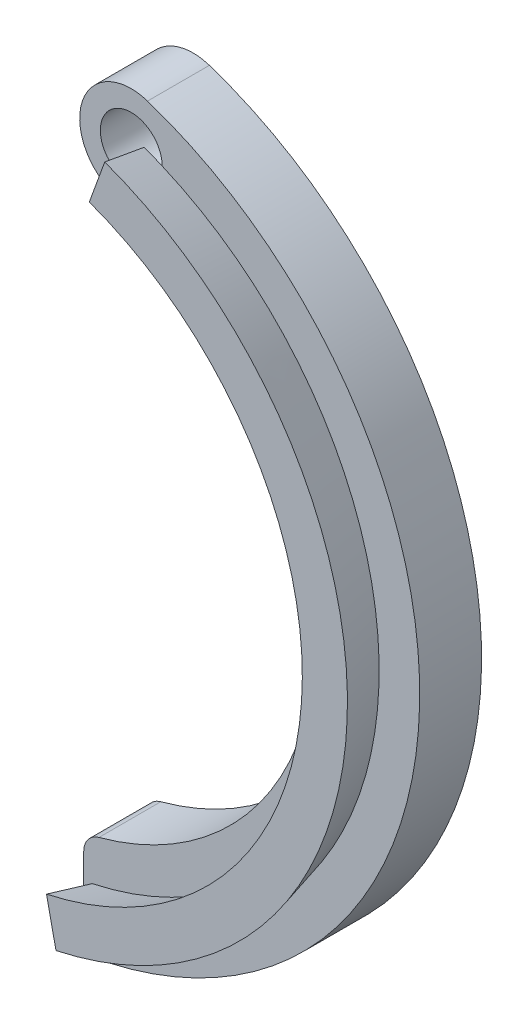
ISO-10303-21;
HEADER;
FILE_DESCRIPTION(('STEP AP214'),'2;1');
FILE_NAME('part.step','',(''),(''),'','','');
FILE_SCHEMA(('AUTOMOTIVE_DESIGN { 1 0 10303 214 1 1 1 1 }'));
ENDSEC;
DATA;
#1=APPLICATION_CONTEXT('core data for automotive mechanical design processes');
#2=APPLICATION_PROTOCOL_DEFINITION('international standard','automotive_design',2000,#1);
#3=PRODUCT_CONTEXT('',#1,'mechanical');
#4=PRODUCT('Part','Part','',(#3));
#5=PRODUCT_RELATED_PRODUCT_CATEGORY('part','',(#4));
#6=PRODUCT_DEFINITION_FORMATION('','',#4);
#7=PRODUCT_DEFINITION_CONTEXT('part definition',#1,'design');
#8=PRODUCT_DEFINITION('design','',#6,#7);
#9=PRODUCT_DEFINITION_SHAPE('','',#8);
#10=(LENGTH_UNIT() NAMED_UNIT(*) SI_UNIT(.MILLI.,.METRE.));
#11=(NAMED_UNIT(*) PLANE_ANGLE_UNIT() SI_UNIT($,.RADIAN.));
#12=(NAMED_UNIT(*) SI_UNIT($,.STERADIAN.) SOLID_ANGLE_UNIT());
#13=UNCERTAINTY_MEASURE_WITH_UNIT(LENGTH_MEASURE(1.E-05),#10,'distance_accuracy_value','');
#14=(GEOMETRIC_REPRESENTATION_CONTEXT(3) GLOBAL_UNCERTAINTY_ASSIGNED_CONTEXT((#13)) GLOBAL_UNIT_ASSIGNED_CONTEXT((#10,
#11,#12)) REPRESENTATION_CONTEXT('',''));
#15=CARTESIAN_POINT('',(0.,0.,0.));
#16=DIRECTION('',(0.,0.,1.));
#17=DIRECTION('',(1.,0.,0.));
#18=AXIS2_PLACEMENT_3D('',#15,#16,#17);
#19=CARTESIAN_POINT('',(-28.,19.,24.));
#20=DIRECTION('',(0.,0.,1.));
#21=DIRECTION('',(1.,0.,0.));
#22=AXIS2_PLACEMENT_3D('',#19,#20,#21);
#23=CYLINDRICAL_SURFACE('',#22,14.2967297963401);
#24=CARTESIAN_POINT('',(-28.,19.,24.));
#25=DIRECTION('',(0.,0.,-1.));
#26=DIRECTION('',(-1.,0.,0.));
#27=AXIS2_PLACEMENT_3D('',#24,#25,#26);
#28=CIRCLE('',#27,14.2967297963401);
#29=CARTESIAN_POINT('',(-24.2614937998681,5.20072269062133,24.));
#30=VERTEX_POINT('',#29);
#31=CARTESIAN_POINT('',(-23.4847562004956,32.5649937818119,24.));
#32=VERTEX_POINT('',#31);
#33=EDGE_CURVE('E161',#30,#32,#28,.F.);
#34=ORIENTED_EDGE('',*,*,#33,.F.);
#35=DIRECTION('',(0.,0.,1.));
#36=VECTOR('',#35,1.);
#37=CARTESIAN_POINT('',(-24.2614937998681,5.20072269062133,24.));
#38=LINE('',#37,#36);
#39=CARTESIAN_POINT('',(-24.2614937998681,5.20072269062133,27.));
#40=VERTEX_POINT('',#39);
#41=EDGE_CURVE('E12',#30,#40,#38,.T.);
#42=ORIENTED_EDGE('',*,*,#41,.T.);
#43=CARTESIAN_POINT('',(-28.,19.,27.));
#44=DIRECTION('',(0.,0.,-1.));
#45=DIRECTION('',(-1.,0.,0.));
#46=AXIS2_PLACEMENT_3D('',#43,#44,#45);
#47=CIRCLE('',#46,14.2967297963401);
#48=CARTESIAN_POINT('',(-23.4847562004956,32.5649937818119,27.));
#49=VERTEX_POINT('',#48);
#50=EDGE_CURVE('E160',#40,#49,#47,.F.);
#51=ORIENTED_EDGE('',*,*,#50,.T.);
#52=DIRECTION('',(0.,0.,1.));
#53=VECTOR('',#52,1.);
#54=CARTESIAN_POINT('',(-23.4847562004956,32.5649937818119,24.));
#55=LINE('',#54,#53);
#56=EDGE_CURVE('E188',#32,#49,#55,.T.);
#57=ORIENTED_EDGE('',*,*,#56,.F.);
#58=EDGE_LOOP('',(#34,#42,#51,#57));
#59=FACE_BOUND('',#58,.T.);
#60=ADVANCED_FACE('F39',(#59),#23,.F.);
#61=CARTESIAN_POINT('',(-22.6951973531534,34.9370386436524,24.));
#62=DIRECTION('',(0.,0.,1.));
#63=DIRECTION('',(1.,0.,0.));
#64=AXIS2_PLACEMENT_3D('',#61,#62,#63);
#65=CYLINDRICAL_SURFACE('',#64,2.5);
#66=CARTESIAN_POINT('',(-22.6951973531534,34.9370386436524,27.));
#67=DIRECTION('',(0.,0.,-1.));
#68=DIRECTION('',(-1.,0.,0.));
#69=AXIS2_PLACEMENT_3D('',#66,#67,#68);
#70=CIRCLE('',#69,2.5);
#71=CARTESIAN_POINT('',(-21.9056385058113,37.3090835054928,27.));
#72=VERTEX_POINT('',#71);
#73=EDGE_CURVE('E176',#72,#49,#70,.F.);
#74=ORIENTED_EDGE('',*,*,#73,.F.);
#75=DIRECTION('',(0.,0.,1.));
#76=VECTOR('',#75,1.);
#77=CARTESIAN_POINT('',(-21.9056385058113,37.3090835054928,24.));
#78=LINE('',#77,#76);
#79=CARTESIAN_POINT('',(-21.9056385058113,37.3090835054928,24.));
#80=VERTEX_POINT('',#79);
#81=EDGE_CURVE('E174',#80,#72,#78,.T.);
#82=ORIENTED_EDGE('',*,*,#81,.F.);
#83=CARTESIAN_POINT('',(-22.6951973531534,34.9370386436524,24.));
#84=DIRECTION('',(0.,0.,-1.));
#85=DIRECTION('',(-1.,0.,0.));
#86=AXIS2_PLACEMENT_3D('',#83,#84,#85);
#87=CIRCLE('',#86,2.5);
#88=EDGE_CURVE('E163',#80,#32,#87,.F.);
#89=ORIENTED_EDGE('',*,*,#88,.T.);
#90=ORIENTED_EDGE('',*,*,#56,.T.);
#91=EDGE_LOOP('',(#74,#82,#89,#90));
#92=FACE_BOUND('',#91,.T.);
#93=ADVANCED_FACE('F223',(#92),#65,.T.);
#94=CARTESIAN_POINT('',(-28.,19.,24.));
#95=DIRECTION('',(0.,0.,1.));
#96=DIRECTION('',(1.,0.,0.));
#97=AXIS2_PLACEMENT_3D('',#94,#95,#96);
#98=CYLINDRICAL_SURFACE('',#97,19.2967297963401);
#99=CARTESIAN_POINT('',(-28.,19.,27.));
#100=DIRECTION('',(0.,0.,-1.));
#101=DIRECTION('',(-1.,0.,0.));
#102=AXIS2_PLACEMENT_3D('',#99,#100,#101);
#103=CIRCLE('',#102,19.2967297963401);
#104=CARTESIAN_POINT('',(-23.7813816980125,0.170049377252877,27.));
#105=VERTEX_POINT('',#104);
#106=EDGE_CURVE('E179',#72,#105,#103,.T.);
#107=ORIENTED_EDGE('',*,*,#106,.T.);
#108=DIRECTION('',(0.,0.,1.));
#109=VECTOR('',#108,1.);
#110=CARTESIAN_POINT('',(-23.7813816980125,0.170049377252877,24.));
#111=LINE('',#110,#109);
#112=CARTESIAN_POINT('',(-23.7813816980125,0.170049377252877,24.));
#113=VERTEX_POINT('',#112);
#114=EDGE_CURVE('E62',#105,#113,#111,.F.);
#115=ORIENTED_EDGE('',*,*,#114,.T.);
#116=CARTESIAN_POINT('',(-28.,19.,24.));
#117=DIRECTION('',(0.,0.,-1.));
#118=DIRECTION('',(-1.,0.,0.));
#119=AXIS2_PLACEMENT_3D('',#116,#117,#118);
#120=CIRCLE('',#119,19.2967297963401);
#121=EDGE_CURVE('E167',#80,#113,#120,.T.);
#122=ORIENTED_EDGE('',*,*,#121,.F.);
#123=ORIENTED_EDGE('',*,*,#81,.T.);
#124=EDGE_LOOP('',(#107,#115,#122,#123));
#125=FACE_BOUND('',#124,.T.);
#126=ADVANCED_FACE('F221',(#125),#98,.T.);
#127=CARTESIAN_POINT('',(-25.,0.,24.));
#128=DIRECTION('',(1.,0.,0.));
#129=DIRECTION('',(0.,1.,0.));
#130=AXIS2_PLACEMENT_3D('',#127,#128,#129);
#131=PLANE('',#130);
#132=DIRECTION('',(0.,1.,0.));
#133=VECTOR('',#132,1.);
#134=CARTESIAN_POINT('',(-25.,0.,24.));
#135=LINE('',#134,#133);
#136=CARTESIAN_POINT('',(-25.,1.14585982915227,24.));
#137=VERTEX_POINT('',#136);
#138=CARTESIAN_POINT('',(-25.,4.23551753490025,24.));
#139=VERTEX_POINT('',#138);
#140=EDGE_CURVE('E169',#137,#139,#135,.T.);
#141=ORIENTED_EDGE('',*,*,#140,.F.);
#142=DIRECTION('',(0.,0.,1.));
#143=VECTOR('',#142,1.);
#144=CARTESIAN_POINT('',(-25.,1.14585982915227,24.));
#145=LINE('',#144,#143);
#146=CARTESIAN_POINT('',(-25.,1.14585982915227,27.));
#147=VERTEX_POINT('',#146);
#148=EDGE_CURVE('E196',#137,#147,#145,.T.);
#149=ORIENTED_EDGE('',*,*,#148,.T.);
#150=DIRECTION('',(0.,1.,0.));
#151=VECTOR('',#150,1.);
#152=CARTESIAN_POINT('',(-25.,0.,27.));
#153=LINE('',#152,#151);
#154=CARTESIAN_POINT('',(-25.,4.23551753490025,27.));
#155=VERTEX_POINT('',#154);
#156=EDGE_CURVE('E181',#147,#155,#153,.T.);
#157=ORIENTED_EDGE('',*,*,#156,.T.);
#158=DIRECTION('',(0.,0.,1.));
#159=VECTOR('',#158,1.);
#160=CARTESIAN_POINT('',(-25.,4.23551753490025,24.));
#161=LINE('',#160,#159);
#162=EDGE_CURVE('E191',#155,#139,#161,.F.);
#163=ORIENTED_EDGE('',*,*,#162,.T.);
#164=EDGE_LOOP('',(#141,#149,#157,#163));
#165=FACE_BOUND('',#164,.T.);
#166=ADVANCED_FACE('F212',(#165),#131,.F.);
#167=CARTESIAN_POINT('',(-22.6951973531534,34.9370386436524,24.));
#168=DIRECTION('',(0.,0.,1.));
#169=DIRECTION('',(1.,0.,0.));
#170=AXIS2_PLACEMENT_3D('',#167,#168,#169);
#171=CYLINDRICAL_SURFACE('',#170,1.49999999999999);
#172=CARTESIAN_POINT('',(-22.6951973531534,34.9370386436524,24.));
#173=DIRECTION('',(0.,0.,-1.));
#174=DIRECTION('',(-1.,0.,0.));
#175=AXIS2_PLACEMENT_3D('',#172,#173,#174);
#176=CIRCLE('',#175,1.49999999999999);
#177=CARTESIAN_POINT('',(-24.1951973531534,34.9370386436524,24.));
#178=VERTEX_POINT('',#177);
#179=EDGE_CURVE('E171',#178,#178,#176,.T.);
#180=ORIENTED_EDGE('',*,*,#179,.T.);
#181=EDGE_LOOP('',(#180));
#182=FACE_BOUND('',#181,.T.);
#183=CARTESIAN_POINT('',(-22.6951973531534,34.9370386436524,27.));
#184=DIRECTION('',(0.,0.,-1.));
#185=DIRECTION('',(-1.,0.,0.));
#186=AXIS2_PLACEMENT_3D('',#183,#184,#185);
#187=CIRCLE('',#186,1.49999999999999);
#188=CARTESIAN_POINT('',(-21.5734336535185,33.9412243024314,27.));
#189=VERTEX_POINT('',#188);
#190=CARTESIAN_POINT('',(-21.1951973805265,34.9367520795101,27.));
#191=VERTEX_POINT('',#190);
#192=EDGE_CURVE('E164',#189,#191,#187,.T.);
#193=ORIENTED_EDGE('',*,*,#192,.F.);
#194=EDGE_CURVE('E184',#191,#189,#187,.T.);
#195=ORIENTED_EDGE('',*,*,#194,.F.);
#196=EDGE_LOOP('',(#193,#195));
#197=FACE_BOUND('',#196,.T.);
#198=ADVANCED_FACE('F245',(#182,#197),#171,.F.);
#199=CARTESIAN_POINT('',(0.,0.,24.));
#200=DIRECTION('',(0.,0.,-1.));
#201=DIRECTION('',(-1.,0.,0.));
#202=AXIS2_PLACEMENT_3D('',#199,#200,#201);
#203=PLANE('',#202);
#204=CARTESIAN_POINT('',(-22.3692023654609,3.17520142781819,24.));
#205=DIRECTION('',(0.,0.,-1.));
#206=DIRECTION('',(-1.,0.,0.));
#207=AXIS2_PLACEMENT_3D('',#204,#205,#206);
#208=CIRCLE('',#207,1.);
#209=CARTESIAN_POINT('',(-23.3692023654609,3.17520142781819,24.));
#210=VERTEX_POINT('',#209);
#211=EDGE_CURVE('E135',#210,#210,#208,.T.);
#212=ORIENTED_EDGE('',*,*,#211,.F.);
#213=EDGE_LOOP('',(#212));
#214=FACE_BOUND('',#213,.T.);
#215=ORIENTED_EDGE('',*,*,#121,.T.);
#216=CARTESIAN_POINT('',(-24.,1.14585982915227,24.));
#217=DIRECTION('',(0.,0.,-1.));
#218=DIRECTION('',(-1.,0.,0.));
#219=AXIS2_PLACEMENT_3D('',#216,#217,#218);
#220=CIRCLE('',#219,1.);
#221=EDGE_CURVE('E47',#113,#137,#220,.T.);
#222=ORIENTED_EDGE('',*,*,#221,.T.);
#223=ORIENTED_EDGE('',*,*,#140,.T.);
#224=CARTESIAN_POINT('',(-24.,4.23551753490025,24.));
#225=DIRECTION('',(0.,0.,-1.));
#226=DIRECTION('',(-1.,0.,0.));
#227=AXIS2_PLACEMENT_3D('',#224,#225,#226);
#228=CIRCLE('',#227,1.);
#229=EDGE_CURVE('E54',#139,#30,#228,.T.);
#230=ORIENTED_EDGE('',*,*,#229,.T.);
#231=ORIENTED_EDGE('',*,*,#33,.T.);
#232=ORIENTED_EDGE('',*,*,#88,.F.);
#233=EDGE_LOOP('',(#215,#222,#223,#230,#231,#232));
#234=FACE_BOUND('',#233,.T.);
#235=ORIENTED_EDGE('',*,*,#179,.F.);
#236=EDGE_LOOP('',(#235));
#237=FACE_BOUND('',#236,.T.);
#238=ADVANCED_FACE('F206',(#214,#234,#237),#203,.T.);
#239=CARTESIAN_POINT('',(0.,0.,27.));
#240=DIRECTION('',(0.,0.,-1.));
#241=DIRECTION('',(-1.,0.,0.));
#242=AXIS2_PLACEMENT_3D('',#239,#240,#241);
#243=PLANE('',#242);
#244=ORIENTED_EDGE('',*,*,#156,.F.);
#245=CARTESIAN_POINT('',(-24.,1.14585982915227,27.));
#246=DIRECTION('',(0.,0.,-1.));
#247=DIRECTION('',(-1.,0.,0.));
#248=AXIS2_PLACEMENT_3D('',#245,#246,#247);
#249=CIRCLE('',#248,1.);
#250=EDGE_CURVE('E201',#147,#105,#249,.F.);
#251=ORIENTED_EDGE('',*,*,#250,.T.);
#252=ORIENTED_EDGE('',*,*,#106,.F.);
#253=ORIENTED_EDGE('',*,*,#73,.T.);
#254=ORIENTED_EDGE('',*,*,#50,.F.);
#255=CARTESIAN_POINT('',(-24.,4.23551753490025,27.));
#256=DIRECTION('',(0.,0.,-1.));
#257=DIRECTION('',(-1.,0.,0.));
#258=AXIS2_PLACEMENT_3D('',#255,#256,#257);
#259=CIRCLE('',#258,1.);
#260=EDGE_CURVE('E199',#40,#155,#259,.F.);
#261=ORIENTED_EDGE('',*,*,#260,.T.);
#262=EDGE_LOOP('',(#244,#251,#252,#253,#254,#261));
#263=FACE_BOUND('',#262,.T.);
#264=CARTESIAN_POINT('',(-28.,19.,27.));
#265=DIRECTION('',(0.,0.,1.));
#266=DIRECTION('',(1.,0.,0.));
#267=AXIS2_PLACEMENT_3D('',#264,#265,#266);
#268=CIRCLE('',#267,16.264714527507);
#269=CARTESIAN_POINT('',(-24.5870416327647,3.09740103489954,27.));
#270=VERTEX_POINT('',#269);
#271=EDGE_CURVE('E153',#270,#189,#268,.T.);
#272=ORIENTED_EDGE('',*,*,#271,.T.);
#273=ORIENTED_EDGE('',*,*,#192,.T.);
#274=CARTESIAN_POINT('',(-28.,19.,27.));
#275=DIRECTION('',(0.,0.,1.));
#276=DIRECTION('',(1.,0.,0.));
#277=AXIS2_PLACEMENT_3D('',#274,#275,#276);
#278=CIRCLE('',#277,17.3287450651732);
#279=CARTESIAN_POINT('',(-24.3637673834454,2.05705993954802,27.));
#280=VERTEX_POINT('',#279);
#281=EDGE_CURVE('E155',#280,#191,#278,.T.);
#282=ORIENTED_EDGE('',*,*,#281,.F.);
#283=DIRECTION('',(0.209838196757973,-0.977736125537643,0.));
#284=VECTOR('',#283,1.);
#285=CARTESIAN_POINT('',(-31.9869257384015,37.5769863852152,27.));
#286=LINE('',#285,#284);
#287=EDGE_CURVE('E287',#270,#280,#286,.T.);
#288=ORIENTED_EDGE('',*,*,#287,.F.);
#289=EDGE_LOOP('',(#272,#273,#282,#288));
#290=FACE_BOUND('',#289,.T.);
#291=ADVANCED_FACE('F218',(#263,#290),#243,.F.);
#292=CARTESIAN_POINT('',(-31.9869257384015,37.5769863852152,27.));
#293=DIRECTION('',(0.,0.,1.));
#294=DIRECTION('',(1.,0.,0.));
#295=AXIS2_PLACEMENT_3D('',#292,#293,#294);
#296=PLANE('',#295);
#297=CARTESIAN_POINT('',(-22.437140006151,34.2838322206877,27.));
#298=VERTEX_POINT('',#297);
#299=EDGE_CURVE('E151',#189,#298,#268,.T.);
#300=ORIENTED_EDGE('',*,*,#299,.T.);
#301=DIRECTION('',(-0.342020143325669,-0.939692620785908,0.));
#302=VECTOR('',#301,1.);
#303=CARTESIAN_POINT('',(-22.437140006151,34.2838322206877,27.));
#304=LINE('',#303,#302);
#305=CARTESIAN_POINT('',(-22.0732201291555,35.2836938652235,27.));
#306=VERTEX_POINT('',#305);
#307=EDGE_CURVE('E130',#306,#298,#304,.T.);
#308=ORIENTED_EDGE('',*,*,#307,.F.);
#309=EDGE_CURVE('E295',#191,#306,#278,.T.);
#310=ORIENTED_EDGE('',*,*,#309,.F.);
#311=ORIENTED_EDGE('',*,*,#194,.T.);
#312=EDGE_LOOP('',(#300,#308,#310,#311));
#313=FACE_BOUND('',#312,.T.);
#314=ADVANCED_FACE('F251',(#313),#296,.F.);
#315=CARTESIAN_POINT('',(-28.,19.,29.1));
#316=DIRECTION('',(0.,0.,-1.));
#317=DIRECTION('',(-1.,0.,0.));
#318=AXIS2_PLACEMENT_3D('',#315,#316,#317);
#319=CONICAL_SURFACE('',#318,15.7020212234016,0.261799387799156);
#320=CARTESIAN_POINT('',(-28.,19.,29.1));
#321=DIRECTION('',(0.,0.,1.));
#322=DIRECTION('',(1.,0.,0.));
#323=AXIS2_PLACEMENT_3D('',#320,#321,#322);
#324=CIRCLE('',#323,15.7020212234016);
#325=CARTESIAN_POINT('',(-24.705116181026,3.6475666059215,29.1));
#326=VERTEX_POINT('',#325);
#327=CARTESIAN_POINT('',(-22.6295924506695,33.7550734750542,29.1));
#328=VERTEX_POINT('',#327);
#329=EDGE_CURVE('E141',#326,#328,#324,.T.);
#330=ORIENTED_EDGE('',*,*,#329,.T.);
#331=DIRECTION('',(-0.0885213269013796,-0.243210346801701,0.965925826289066));
#332=VECTOR('',#331,1.);
#333=CARTESIAN_POINT('',(-22.6295924506695,33.7550734750542,29.1));
#334=LINE('',#333,#332);
#335=EDGE_CURVE('E124',#298,#328,#334,.T.);
#336=ORIENTED_EDGE('',*,*,#335,.F.);
#337=ORIENTED_EDGE('',*,*,#299,.F.);
#338=ORIENTED_EDGE('',*,*,#271,.F.);
#339=DIRECTION('',(0.054310121710935,-0.253056730373899,-0.965925826289066));
#340=VECTOR('',#339,1.);
#341=CARTESIAN_POINT('',(-23.6663320471957,-1.19262354998533,10.6248356807872));
#342=LINE('',#341,#340);
#343=EDGE_CURVE('E149',#326,#270,#342,.T.);
#344=ORIENTED_EDGE('',*,*,#343,.F.);
#345=EDGE_LOOP('',(#330,#336,#337,#338,#344));
#346=FACE_BOUND('',#345,.T.);
#347=ADVANCED_FACE('F146',(#346),#319,.F.);
#348=CARTESIAN_POINT('',(-31.9869257384015,37.5769863852152,29.1));
#349=DIRECTION('',(0.,0.,1.));
#350=DIRECTION('',(1.,0.,0.));
#351=AXIS2_PLACEMENT_3D('',#348,#349,#350);
#352=PLANE('',#351);
#353=DIRECTION('',(0.342020143325669,0.939692620785908,0.));
#354=VECTOR('',#353,1.);
#355=CARTESIAN_POINT('',(-22.6295924506695,33.7550734750542,29.1));
#356=LINE('',#355,#354);
#357=CARTESIAN_POINT('',(-21.880767684637,35.812452610857,29.1));
#358=VERTEX_POINT('',#357);
#359=EDGE_CURVE('E127',#328,#358,#356,.T.);
#360=ORIENTED_EDGE('',*,*,#359,.F.);
#361=ORIENTED_EDGE('',*,*,#329,.F.);
#362=DIRECTION('',(0.209838196757973,-0.977736125537643,0.));
#363=VECTOR('',#362,1.);
#364=CARTESIAN_POINT('',(-31.9869257384015,37.5769863852152,29.1));
#365=LINE('',#364,#363);
#366=CARTESIAN_POINT('',(-24.2456928351842,1.50689436852606,29.1));
#367=VERTEX_POINT('',#366);
#368=EDGE_CURVE('E291',#326,#367,#365,.T.);
#369=ORIENTED_EDGE('',*,*,#368,.T.);
#370=CARTESIAN_POINT('',(-28.,19.,29.1));
#371=DIRECTION('',(0.,0.,1.));
#372=DIRECTION('',(1.,0.,0.));
#373=AXIS2_PLACEMENT_3D('',#370,#371,#372);
#374=CIRCLE('',#373,17.8914383692786);
#375=EDGE_CURVE('E143',#367,#358,#374,.T.);
#376=ORIENTED_EDGE('',*,*,#375,.T.);
#377=EDGE_LOOP('',(#360,#361,#369,#376));
#378=FACE_BOUND('',#377,.T.);
#379=ADVANCED_FACE('F139',(#378),#352,.T.);
#380=CARTESIAN_POINT('',(-28.,19.,27.));
#381=DIRECTION('',(0.,0.,1.));
#382=DIRECTION('',(1.,0.,0.));
#383=AXIS2_PLACEMENT_3D('',#380,#381,#382);
#384=CONICAL_SURFACE('',#383,17.3287450651732,0.261799387799156);
#385=ORIENTED_EDGE('',*,*,#309,.T.);
#386=DIRECTION('',(-0.0885213269013796,-0.243210346801701,-0.965925826289066));
#387=VECTOR('',#386,1.);
#388=CARTESIAN_POINT('',(-22.0732201291555,35.2836938652235,27.));
#389=LINE('',#388,#387);
#390=EDGE_CURVE('E144',#358,#306,#389,.T.);
#391=ORIENTED_EDGE('',*,*,#390,.F.);
#392=ORIENTED_EDGE('',*,*,#375,.F.);
#393=DIRECTION('',(0.054310121710935,-0.253056730373899,0.965925826289066));
#394=VECTOR('',#393,1.);
#395=CARTESIAN_POINT('',(-26.2908299928081,11.0361626885098,-7.27352921738337));
#396=LINE('',#395,#394);
#397=EDGE_CURVE('E293',#280,#367,#396,.T.);
#398=ORIENTED_EDGE('',*,*,#397,.F.);
#399=ORIENTED_EDGE('',*,*,#281,.T.);
#400=EDGE_LOOP('',(#385,#391,#392,#398,#399));
#401=FACE_BOUND('',#400,.T.);
#402=ADVANCED_FACE('F259',(#401),#384,.T.);
#403=CARTESIAN_POINT('',(-31.9869257384015,37.5769863852152,0.));
#404=DIRECTION('',(0.977736125537643,0.209838196757973,0.));
#405=DIRECTION('',(-0.209838196757973,0.977736125537643,0.));
#406=AXIS2_PLACEMENT_3D('',#403,#404,#405);
#407=PLANE('',#406);
#408=ORIENTED_EDGE('',*,*,#287,.T.);
#409=ORIENTED_EDGE('',*,*,#397,.T.);
#410=ORIENTED_EDGE('',*,*,#368,.F.);
#411=ORIENTED_EDGE('',*,*,#343,.T.);
#412=EDGE_LOOP('',(#408,#409,#410,#411));
#413=FACE_BOUND('',#412,.T.);
#414=ADVANCED_FACE('F262',(#413),#407,.F.);
#415=CARTESIAN_POINT('',(-34.4983827231877,1.14584020506775,0.));
#416=DIRECTION('',(0.939692620785908,-0.342020143325669,0.));
#417=DIRECTION('',(0.,0.,-1.));
#418=AXIS2_PLACEMENT_3D('',#415,#416,#417);
#419=PLANE('',#418);
#420=ORIENTED_EDGE('',*,*,#335,.T.);
#421=ORIENTED_EDGE('',*,*,#359,.T.);
#422=ORIENTED_EDGE('',*,*,#390,.T.);
#423=ORIENTED_EDGE('',*,*,#307,.T.);
#424=EDGE_LOOP('',(#420,#421,#422,#423));
#425=FACE_BOUND('',#424,.T.);
#426=ADVANCED_FACE('F126',(#425),#419,.F.);
#427=CARTESIAN_POINT('',(-22.3692023654609,3.17520142781819,29.8284271247462));
#428=DIRECTION('',(0.,0.,-1.));
#429=DIRECTION('',(-1.,0.,0.));
#430=AXIS2_PLACEMENT_3D('',#427,#428,#429);
#431=CYLINDRICAL_SURFACE('',#430,1.);
#432=ORIENTED_EDGE('',*,*,#211,.T.);
#433=EDGE_LOOP('',(#432));
#434=FACE_BOUND('',#433,.T.);
#435=CARTESIAN_POINT('',(-22.3692023654609,3.17520142781819,26.));
#436=DIRECTION('',(0.,0.,-1.));
#437=DIRECTION('',(-1.,0.,0.));
#438=AXIS2_PLACEMENT_3D('',#435,#436,#437);
#439=CIRCLE('',#438,1.);
#440=CARTESIAN_POINT('',(-23.3692023654609,3.17520142781819,26.));
#441=VERTEX_POINT('',#440);
#442=EDGE_CURVE('E194',#441,#441,#439,.F.);
#443=ORIENTED_EDGE('',*,*,#442,.T.);
#444=EDGE_LOOP('',(#443));
#445=FACE_BOUND('',#444,.T.);
#446=ADVANCED_FACE('F272',(#434,#445),#431,.F.);
#447=CARTESIAN_POINT('',(0.,0.,26.));
#448=DIRECTION('',(0.,0.,-1.));
#449=DIRECTION('',(-1.,0.,0.));
#450=AXIS2_PLACEMENT_3D('',#447,#448,#449);
#451=PLANE('',#450);
#452=ORIENTED_EDGE('',*,*,#442,.F.);
#453=EDGE_LOOP('',(#452));
#454=FACE_BOUND('',#453,.T.);
#455=ADVANCED_FACE('F233',(#454),#451,.T.);
#456=CARTESIAN_POINT('',(-24.,1.14585982915227,24.));
#457=DIRECTION('',(0.,0.,1.));
#458=DIRECTION('',(1.,0.,0.));
#459=AXIS2_PLACEMENT_3D('',#456,#457,#458);
#460=CYLINDRICAL_SURFACE('',#459,1.);
#461=ORIENTED_EDGE('',*,*,#221,.F.);
#462=ORIENTED_EDGE('',*,*,#114,.F.);
#463=ORIENTED_EDGE('',*,*,#250,.F.);
#464=ORIENTED_EDGE('',*,*,#148,.F.);
#465=EDGE_LOOP('',(#461,#462,#463,#464));
#466=FACE_BOUND('',#465,.T.);
#467=ADVANCED_FACE('F215',(#466),#460,.T.);
#468=CARTESIAN_POINT('',(-24.,4.23551753490025,24.));
#469=DIRECTION('',(0.,0.,1.));
#470=DIRECTION('',(1.,0.,0.));
#471=AXIS2_PLACEMENT_3D('',#468,#469,#470);
#472=CYLINDRICAL_SURFACE('',#471,1.);
#473=ORIENTED_EDGE('',*,*,#229,.F.);
#474=ORIENTED_EDGE('',*,*,#162,.F.);
#475=ORIENTED_EDGE('',*,*,#260,.F.);
#476=ORIENTED_EDGE('',*,*,#41,.F.);
#477=EDGE_LOOP('',(#473,#474,#475,#476));
#478=FACE_BOUND('',#477,.T.);
#479=ADVANCED_FACE('F41',(#478),#472,.T.);
#480=CLOSED_SHELL('',(#60,#93,#126,#166,#198,#238,#291,#314,#347,#379,#402,#414,#426,#446,#455,
#467,#479));
#481=MANIFOLD_SOLID_BREP('B2',#480);
#482=ADVANCED_BREP_SHAPE_REPRESENTATION('',(#18,#481),#14);
#483=SHAPE_DEFINITION_REPRESENTATION(#9,#482);
ENDSEC;
END-ISO-10303-21;
